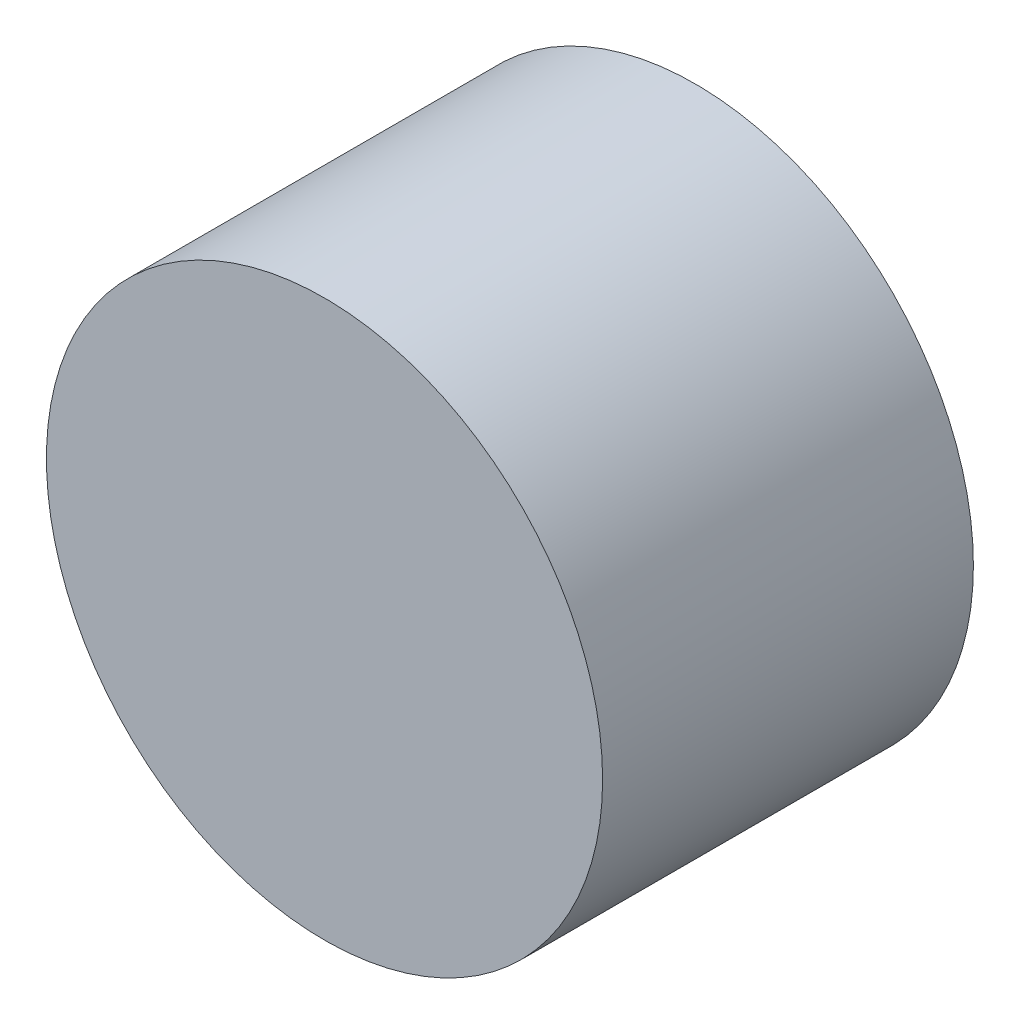
ISO-10303-21;
HEADER;
FILE_DESCRIPTION(('STEP AP214'),'2;1');
FILE_NAME('part.step','',(''),(''),'','','');
FILE_SCHEMA(('AUTOMOTIVE_DESIGN { 1 0 10303 214 1 1 1 1 }'));
ENDSEC;
DATA;
#1=APPLICATION_CONTEXT('core data for automotive mechanical design processes');
#2=APPLICATION_PROTOCOL_DEFINITION('international standard','automotive_design',2000,#1);
#3=PRODUCT_CONTEXT('',#1,'mechanical');
#4=PRODUCT('Part','Part','',(#3));
#5=PRODUCT_RELATED_PRODUCT_CATEGORY('part','',(#4));
#6=PRODUCT_DEFINITION_FORMATION('','',#4);
#7=PRODUCT_DEFINITION_CONTEXT('part definition',#1,'design');
#8=PRODUCT_DEFINITION('design','',#6,#7);
#9=PRODUCT_DEFINITION_SHAPE('','',#8);
#10=(LENGTH_UNIT() NAMED_UNIT(*) SI_UNIT(.MILLI.,.METRE.));
#11=(NAMED_UNIT(*) PLANE_ANGLE_UNIT() SI_UNIT($,.RADIAN.));
#12=(NAMED_UNIT(*) SI_UNIT($,.STERADIAN.) SOLID_ANGLE_UNIT());
#13=UNCERTAINTY_MEASURE_WITH_UNIT(LENGTH_MEASURE(1.E-05),#10,'distance_accuracy_value','');
#14=(GEOMETRIC_REPRESENTATION_CONTEXT(3) GLOBAL_UNCERTAINTY_ASSIGNED_CONTEXT((#13)) GLOBAL_UNIT_ASSIGNED_CONTEXT((#10,
#11,#12)) REPRESENTATION_CONTEXT('',''));
#15=CARTESIAN_POINT('',(0.,0.,0.));
#16=DIRECTION('',(0.,0.,1.));
#17=DIRECTION('',(1.,0.,0.));
#18=AXIS2_PLACEMENT_3D('',#15,#16,#17);
#19=CARTESIAN_POINT('',(0.,0.,8.));
#20=DIRECTION('',(0.,0.,-1.));
#21=DIRECTION('',(-1.,0.,0.));
#22=AXIS2_PLACEMENT_3D('',#19,#20,#21);
#23=CYLINDRICAL_SURFACE('',#22,6.);
#24=CARTESIAN_POINT('',(0.,0.,8.));
#25=DIRECTION('',(0.,0.,1.));
#26=DIRECTION('',(1.,0.,0.));
#27=AXIS2_PLACEMENT_3D('',#24,#25,#26);
#28=CIRCLE('',#27,6.);
#29=CARTESIAN_POINT('',(6.,0.,8.));
#30=VERTEX_POINT('',#29);
#31=EDGE_CURVE('E10',#30,#30,#28,.T.);
#32=ORIENTED_EDGE('',*,*,#31,.F.);
#33=EDGE_LOOP('',(#32));
#34=FACE_BOUND('',#33,.T.);
#35=CARTESIAN_POINT('',(0.,0.,0.));
#36=DIRECTION('',(0.,0.,1.));
#37=DIRECTION('',(1.,0.,0.));
#38=AXIS2_PLACEMENT_3D('',#35,#36,#37);
#39=CIRCLE('',#38,6.);
#40=CARTESIAN_POINT('',(6.,0.,0.));
#41=VERTEX_POINT('',#40);
#42=EDGE_CURVE('E44',#41,#41,#39,.T.);
#43=ORIENTED_EDGE('',*,*,#42,.T.);
#44=EDGE_LOOP('',(#43));
#45=FACE_BOUND('',#44,.T.);
#46=ADVANCED_FACE('F37',(#34,#45),#23,.T.);
#47=CARTESIAN_POINT('',(0.,0.,8.));
#48=DIRECTION('',(0.,0.,1.));
#49=DIRECTION('',(1.,0.,0.));
#50=AXIS2_PLACEMENT_3D('',#47,#48,#49);
#51=PLANE('',#50);
#52=ORIENTED_EDGE('',*,*,#31,.T.);
#53=EDGE_LOOP('',(#52));
#54=FACE_BOUND('',#53,.T.);
#55=ADVANCED_FACE('F62',(#54),#51,.T.);
#56=CARTESIAN_POINT('',(0.,0.,0.));
#57=DIRECTION('',(0.,0.,1.));
#58=DIRECTION('',(1.,0.,0.));
#59=AXIS2_PLACEMENT_3D('',#56,#57,#58);
#60=PLANE('',#59);
#61=CARTESIAN_POINT('',(0.,0.,0.));
#62=DIRECTION('',(0.,0.,1.));
#63=DIRECTION('',(1.,0.,0.));
#64=AXIS2_PLACEMENT_3D('',#61,#62,#63);
#65=CIRCLE('',#64,4.2);
#66=CARTESIAN_POINT('',(4.2,0.,0.));
#67=VERTEX_POINT('',#66);
#68=EDGE_CURVE('E40',#67,#67,#65,.F.);
#69=ORIENTED_EDGE('',*,*,#68,.F.);
#70=EDGE_LOOP('',(#69));
#71=FACE_BOUND('',#70,.T.);
#72=ORIENTED_EDGE('',*,*,#42,.F.);
#73=EDGE_LOOP('',(#72));
#74=FACE_BOUND('',#73,.T.);
#75=ADVANCED_FACE('F59',(#71,#74),#60,.F.);
#76=CARTESIAN_POINT('',(0.,0.,5.5));
#77=DIRECTION('',(0.,0.,-1.));
#78=DIRECTION('',(-1.,0.,0.));
#79=AXIS2_PLACEMENT_3D('',#76,#77,#78);
#80=CYLINDRICAL_SURFACE('',#79,4.2);
#81=CARTESIAN_POINT('',(0.,0.,5.5));
#82=DIRECTION('',(0.,0.,1.));
#83=DIRECTION('',(1.,0.,0.));
#84=AXIS2_PLACEMENT_3D('',#81,#82,#83);
#85=CIRCLE('',#84,4.2);
#86=CARTESIAN_POINT('',(4.2,0.,5.5));
#87=VERTEX_POINT('',#86);
#88=EDGE_CURVE('E50',#87,#87,#85,.T.);
#89=ORIENTED_EDGE('',*,*,#88,.T.);
#90=EDGE_LOOP('',(#89));
#91=FACE_BOUND('',#90,.T.);
#92=ORIENTED_EDGE('',*,*,#68,.T.);
#93=EDGE_LOOP('',(#92));
#94=FACE_BOUND('',#93,.T.);
#95=ADVANCED_FACE('F57',(#91,#94),#80,.F.);
#96=CARTESIAN_POINT('',(0.,0.,5.5));
#97=DIRECTION('',(0.,0.,1.));
#98=DIRECTION('',(1.,0.,0.));
#99=AXIS2_PLACEMENT_3D('',#96,#97,#98);
#100=PLANE('',#99);
#101=ORIENTED_EDGE('',*,*,#88,.F.);
#102=EDGE_LOOP('',(#101));
#103=FACE_BOUND('',#102,.T.);
#104=ADVANCED_FACE('F76',(#103),#100,.F.);
#105=CLOSED_SHELL('',(#46,#55,#75,#95,#104));
#106=MANIFOLD_SOLID_BREP('B2',#105);
#107=ADVANCED_BREP_SHAPE_REPRESENTATION('',(#18,#106),#14);
#108=SHAPE_DEFINITION_REPRESENTATION(#9,#107);
ENDSEC;
END-ISO-10303-21;
